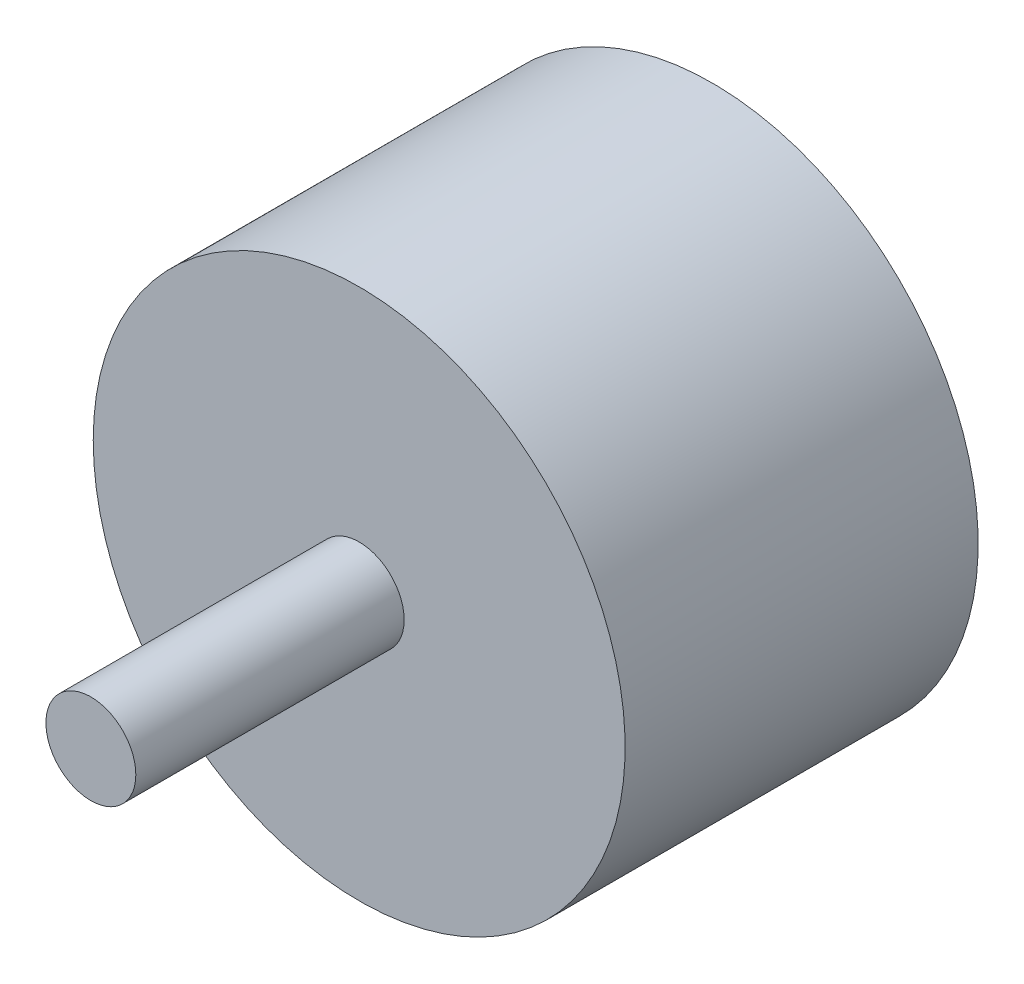
ISO-10303-21;
HEADER;
FILE_DESCRIPTION(('STEP AP214'),'2;1');
FILE_NAME('part.step','',(''),(''),'','','');
FILE_SCHEMA(('AUTOMOTIVE_DESIGN { 1 0 10303 214 1 1 1 1 }'));
ENDSEC;
DATA;
#1=APPLICATION_CONTEXT('core data for automotive mechanical design processes');
#2=APPLICATION_PROTOCOL_DEFINITION('international standard','automotive_design',2000,#1);
#3=PRODUCT_CONTEXT('',#1,'mechanical');
#4=PRODUCT('Part','Part','',(#3));
#5=PRODUCT_RELATED_PRODUCT_CATEGORY('part','',(#4));
#6=PRODUCT_DEFINITION_FORMATION('','',#4);
#7=PRODUCT_DEFINITION_CONTEXT('part definition',#1,'design');
#8=PRODUCT_DEFINITION('design','',#6,#7);
#9=PRODUCT_DEFINITION_SHAPE('','',#8);
#10=(LENGTH_UNIT() NAMED_UNIT(*) SI_UNIT(.MILLI.,.METRE.));
#11=(NAMED_UNIT(*) PLANE_ANGLE_UNIT() SI_UNIT($,.RADIAN.));
#12=(NAMED_UNIT(*) SI_UNIT($,.STERADIAN.) SOLID_ANGLE_UNIT());
#13=UNCERTAINTY_MEASURE_WITH_UNIT(LENGTH_MEASURE(1.E-05),#10,'distance_accuracy_value','');
#14=(GEOMETRIC_REPRESENTATION_CONTEXT(3) GLOBAL_UNCERTAINTY_ASSIGNED_CONTEXT((#13)) GLOBAL_UNIT_ASSIGNED_CONTEXT((#10,
#11,#12)) REPRESENTATION_CONTEXT('',''));
#15=CARTESIAN_POINT('',(0.,0.,0.));
#16=DIRECTION('',(0.,0.,1.));
#17=DIRECTION('',(1.,0.,0.));
#18=AXIS2_PLACEMENT_3D('',#15,#16,#17);
#19=CARTESIAN_POINT('',(0.,0.,19.05));
#20=DIRECTION('',(0.,0.,-1.));
#21=DIRECTION('',(-1.,0.,0.));
#22=AXIS2_PLACEMENT_3D('',#19,#20,#21);
#23=CYLINDRICAL_SURFACE('',#22,14.351);
#24=CARTESIAN_POINT('',(0.,0.,19.05));
#25=DIRECTION('',(0.,0.,1.));
#26=DIRECTION('',(1.,0.,0.));
#27=AXIS2_PLACEMENT_3D('',#24,#25,#26);
#28=CIRCLE('',#27,14.351);
#29=CARTESIAN_POINT('',(-14.351,0.,19.05));
#30=VERTEX_POINT('',#29);
#31=EDGE_CURVE('E38',#30,#30,#28,.T.);
#32=CARTESIAN_POINT('',(0.,0.,0.));
#33=DIRECTION('',(0.,0.,1.));
#34=DIRECTION('',(1.,0.,0.));
#35=AXIS2_PLACEMENT_3D('',#32,#33,#34);
#36=CIRCLE('',#35,14.351);
#37=CARTESIAN_POINT('',(-14.351,0.,0.));
#38=VERTEX_POINT('',#37);
#39=EDGE_CURVE('E34',#38,#38,#36,.T.);
#40=CARTESIAN_POINT('',(-14.351,0.,19.05));
#41=CARTESIAN_POINT('',(-14.351,0.,18.8515625));
#42=CARTESIAN_POINT('',(-14.351,0.,18.653125));
#43=CARTESIAN_POINT('',(-14.351,0.,18.25625));
#44=CARTESIAN_POINT('',(-14.351,0.,18.0578125));
#45=CARTESIAN_POINT('',(-14.351,0.,17.6609375));
#46=CARTESIAN_POINT('',(-14.351,0.,17.4625));
#47=CARTESIAN_POINT('',(-14.351,0.,17.065625));
#48=CARTESIAN_POINT('',(-14.351,0.,16.8671875));
#49=CARTESIAN_POINT('',(-14.351,0.,16.4703125));
#50=CARTESIAN_POINT('',(-14.351,0.,16.271875));
#51=CARTESIAN_POINT('',(-14.351,0.,15.875));
#52=CARTESIAN_POINT('',(-14.351,0.,15.6765625));
#53=CARTESIAN_POINT('',(-14.351,0.,15.2796875));
#54=CARTESIAN_POINT('',(-14.351,0.,15.08125));
#55=CARTESIAN_POINT('',(-14.351,0.,14.684375));
#56=CARTESIAN_POINT('',(-14.351,0.,14.4859375));
#57=CARTESIAN_POINT('',(-14.351,0.,14.0890625));
#58=CARTESIAN_POINT('',(-14.351,0.,13.890625));
#59=CARTESIAN_POINT('',(-14.351,0.,13.49375));
#60=CARTESIAN_POINT('',(-14.351,0.,13.2953125));
#61=CARTESIAN_POINT('',(-14.351,0.,12.8984375));
#62=CARTESIAN_POINT('',(-14.351,0.,12.7));
#63=CARTESIAN_POINT('',(-14.351,0.,12.303125));
#64=CARTESIAN_POINT('',(-14.351,0.,12.1046875));
#65=CARTESIAN_POINT('',(-14.351,0.,11.7078125));
#66=CARTESIAN_POINT('',(-14.351,0.,11.509375));
#67=CARTESIAN_POINT('',(-14.351,0.,11.1125));
#68=CARTESIAN_POINT('',(-14.351,0.,10.9140625));
#69=CARTESIAN_POINT('',(-14.351,0.,10.5171875));
#70=CARTESIAN_POINT('',(-14.351,0.,10.31875));
#71=CARTESIAN_POINT('',(-14.351,0.,9.921875));
#72=CARTESIAN_POINT('',(-14.351,0.,9.7234375));
#73=CARTESIAN_POINT('',(-14.351,0.,9.3265625));
#74=CARTESIAN_POINT('',(-14.351,0.,9.128125));
#75=CARTESIAN_POINT('',(-14.351,0.,8.73125));
#76=CARTESIAN_POINT('',(-14.351,0.,8.5328125));
#77=CARTESIAN_POINT('',(-14.351,0.,8.1359375));
#78=CARTESIAN_POINT('',(-14.351,0.,7.9375));
#79=CARTESIAN_POINT('',(-14.351,0.,7.540625));
#80=CARTESIAN_POINT('',(-14.351,0.,7.3421875));
#81=CARTESIAN_POINT('',(-14.351,0.,6.9453125));
#82=CARTESIAN_POINT('',(-14.351,0.,6.746875));
#83=CARTESIAN_POINT('',(-14.351,0.,6.35));
#84=CARTESIAN_POINT('',(-14.351,0.,6.1515625));
#85=CARTESIAN_POINT('',(-14.351,0.,5.7546875));
#86=CARTESIAN_POINT('',(-14.351,0.,5.55625));
#87=CARTESIAN_POINT('',(-14.351,0.,5.159375));
#88=CARTESIAN_POINT('',(-14.351,0.,4.9609375));
#89=CARTESIAN_POINT('',(-14.351,0.,4.5640625));
#90=CARTESIAN_POINT('',(-14.351,0.,4.365625));
#91=CARTESIAN_POINT('',(-14.351,0.,3.96875));
#92=CARTESIAN_POINT('',(-14.351,0.,3.7703125));
#93=CARTESIAN_POINT('',(-14.351,0.,3.3734375));
#94=CARTESIAN_POINT('',(-14.351,0.,3.175));
#95=CARTESIAN_POINT('',(-14.351,0.,2.778125));
#96=CARTESIAN_POINT('',(-14.351,0.,2.5796875));
#97=CARTESIAN_POINT('',(-14.351,0.,2.1828125));
#98=CARTESIAN_POINT('',(-14.351,0.,1.984375));
#99=CARTESIAN_POINT('',(-14.351,0.,1.5875));
#100=CARTESIAN_POINT('',(-14.351,0.,1.3890625));
#101=CARTESIAN_POINT('',(-14.351,0.,0.992187500000001));
#102=CARTESIAN_POINT('',(-14.351,0.,0.793750000000001));
#103=CARTESIAN_POINT('',(-14.351,0.,0.396875));
#104=CARTESIAN_POINT('',(-14.351,0.,0.1984375));
#105=CARTESIAN_POINT('',(-14.351,0.,0.));
#106=B_SPLINE_CURVE_WITH_KNOTS('',3,(#40,#41,#42,#43,#44,#45,#46,#47,#48,#49,#50,#51,#52,#53,
#54,#55,#56,#57,#58,#59,#60,#61,#62,#63,#64,#65,#66,#67,#68,#69,#70,#71,#72,#73,#74,#75,#76,#77,
#78,#79,#80,#81,#82,#83,#84,#85,#86,#87,#88,#89,#90,#91,#92,#93,#94,#95,#96,#97,#98,#99,#100,
#101,#102,#103,#104,#105),.UNSPECIFIED.,.F.,.F.,(4,2,2,2,2,2,2,2,2,2,2,2,2,2,2,2,2,2,2,2,2,2,2,
2,2,2,2,2,2,2,2,2,4),(0.,0.5953125,1.190625,1.7859375,2.38125,2.9765625,3.571875,4.1671875,
4.7625,5.3578125,5.953125,6.5484375,7.14375,7.7390625,8.334375,8.9296875,9.525,10.1203125,
10.715625,11.3109375,11.90625,12.5015625,13.096875,13.6921875,14.2875,14.8828125,15.478125,
16.0734375,16.66875,17.2640625,17.859375,18.4546875,19.05),.UNSPECIFIED.);
#107=EDGE_CURVE('BSEAM31',#30,#38,#106,.T.);
#108=ORIENTED_EDGE('',*,*,#31,.F.);
#109=ORIENTED_EDGE('',*,*,#39,.T.);
#110=ORIENTED_EDGE('',*,*,#107,.T.);
#111=ORIENTED_EDGE('',*,*,#107,.F.);
#112=EDGE_LOOP('',(#108,#110,#109,#111));
#113=FACE_BOUND('',#112,.T.);
#114=ADVANCED_FACE('F31',(#113),#23,.T.);
#115=CARTESIAN_POINT('',(0.,0.,19.05));
#116=DIRECTION('',(0.,0.,1.));
#117=DIRECTION('',(1.,0.,0.));
#118=AXIS2_PLACEMENT_3D('',#115,#116,#117);
#119=PLANE('',#118);
#120=CARTESIAN_POINT('',(0.,0.,19.05));
#121=DIRECTION('',(0.,0.,1.));
#122=DIRECTION('',(1.,0.,0.));
#123=AXIS2_PLACEMENT_3D('',#120,#121,#122);
#124=CIRCLE('',#123,2.4257);
#125=CARTESIAN_POINT('',(2.4257,0.,19.05));
#126=VERTEX_POINT('',#125);
#127=EDGE_CURVE('E10',#126,#126,#124,.T.);
#128=ORIENTED_EDGE('',*,*,#127,.F.);
#129=EDGE_LOOP('',(#128));
#130=FACE_BOUND('',#129,.T.);
#131=ORIENTED_EDGE('',*,*,#31,.T.);
#132=EDGE_LOOP('',(#131));
#133=FACE_BOUND('',#132,.T.);
#134=ADVANCED_FACE('F85',(#130,#133),#119,.T.);
#135=CARTESIAN_POINT('',(0.,0.,0.));
#136=DIRECTION('',(0.,0.,1.));
#137=DIRECTION('',(1.,0.,0.));
#138=AXIS2_PLACEMENT_3D('',#135,#136,#137);
#139=PLANE('',#138);
#140=CARTESIAN_POINT('',(0.,8.001,0.));
#141=DIRECTION('',(0.,0.,-1.));
#142=DIRECTION('',(-1.,0.,0.));
#143=AXIS2_PLACEMENT_3D('',#140,#141,#142);
#144=CIRCLE('',#143,1.2065);
#145=CARTESIAN_POINT('',(-1.2065,8.001,0.));
#146=VERTEX_POINT('',#145);
#147=EDGE_CURVE('E66',#146,#146,#144,.T.);
#148=ORIENTED_EDGE('',*,*,#147,.F.);
#149=EDGE_LOOP('',(#148));
#150=FACE_BOUND('',#149,.T.);
#151=CARTESIAN_POINT('',(-9.525,0.,0.));
#152=DIRECTION('',(0.,0.,-1.));
#153=DIRECTION('',(-1.,0.,0.));
#154=AXIS2_PLACEMENT_3D('',#151,#152,#153);
#155=CIRCLE('',#154,1.2065);
#156=CARTESIAN_POINT('',(-10.7315,0.,0.));
#157=VERTEX_POINT('',#156);
#158=EDGE_CURVE('E60',#157,#157,#155,.T.);
#159=ORIENTED_EDGE('',*,*,#158,.F.);
#160=EDGE_LOOP('',(#159));
#161=FACE_BOUND('',#160,.T.);
#162=CARTESIAN_POINT('',(0.,-8.001,0.));
#163=DIRECTION('',(0.,0.,-1.));
#164=DIRECTION('',(-1.,0.,0.));
#165=AXIS2_PLACEMENT_3D('',#162,#163,#164);
#166=CIRCLE('',#165,1.2065);
#167=CARTESIAN_POINT('',(-1.2065,-8.001,0.));
#168=VERTEX_POINT('',#167);
#169=EDGE_CURVE('E54',#168,#168,#166,.T.);
#170=ORIENTED_EDGE('',*,*,#169,.F.);
#171=EDGE_LOOP('',(#170));
#172=FACE_BOUND('',#171,.T.);
#173=CARTESIAN_POINT('',(9.525,0.,0.));
#174=DIRECTION('',(0.,0.,-1.));
#175=DIRECTION('',(-1.,0.,0.));
#176=AXIS2_PLACEMENT_3D('',#173,#174,#175);
#177=CIRCLE('',#176,1.2065);
#178=CARTESIAN_POINT('',(8.3185,0.,0.));
#179=VERTEX_POINT('',#178);
#180=EDGE_CURVE('E48',#179,#179,#177,.T.);
#181=ORIENTED_EDGE('',*,*,#180,.F.);
#182=EDGE_LOOP('',(#181));
#183=FACE_BOUND('',#182,.T.);
#184=ORIENTED_EDGE('',*,*,#39,.F.);
#185=EDGE_LOOP('',(#184));
#186=FACE_BOUND('',#185,.T.);
#187=ADVANCED_FACE('F81',(#150,#161,#172,#183,#186),#139,.F.);
#188=CARTESIAN_POINT('',(0.,0.,33.528));
#189=DIRECTION('',(0.,0.,-1.));
#190=DIRECTION('',(-1.,0.,0.));
#191=AXIS2_PLACEMENT_3D('',#188,#189,#190);
#192=CYLINDRICAL_SURFACE('',#191,2.4257);
#193=CARTESIAN_POINT('',(0.,0.,33.528));
#194=DIRECTION('',(0.,0.,1.));
#195=DIRECTION('',(1.,0.,0.));
#196=AXIS2_PLACEMENT_3D('',#193,#194,#195);
#197=CIRCLE('',#196,2.4257);
#198=CARTESIAN_POINT('',(2.4257,0.,33.528));
#199=VERTEX_POINT('',#198);
#200=EDGE_CURVE('E44',#199,#199,#197,.T.);
#201=ORIENTED_EDGE('',*,*,#200,.F.);
#202=EDGE_LOOP('',(#201));
#203=FACE_BOUND('',#202,.T.);
#204=ORIENTED_EDGE('',*,*,#127,.T.);
#205=EDGE_LOOP('',(#204));
#206=FACE_BOUND('',#205,.T.);
#207=ADVANCED_FACE('F84',(#203,#206),#192,.T.);
#208=CARTESIAN_POINT('',(0.,0.,33.528));
#209=DIRECTION('',(0.,0.,1.));
#210=DIRECTION('',(1.,0.,0.));
#211=AXIS2_PLACEMENT_3D('',#208,#209,#210);
#212=PLANE('',#211);
#213=ORIENTED_EDGE('',*,*,#200,.T.);
#214=EDGE_LOOP('',(#213));
#215=FACE_BOUND('',#214,.T.);
#216=ADVANCED_FACE('F109',(#215),#212,.T.);
#217=CARTESIAN_POINT('',(9.525,0.,5.08));
#218=DIRECTION('',(0.,0.,-1.));
#219=DIRECTION('',(-1.,0.,0.));
#220=AXIS2_PLACEMENT_3D('',#217,#218,#219);
#221=CYLINDRICAL_SURFACE('',#220,1.2065);
#222=CARTESIAN_POINT('',(9.525,0.,5.08));
#223=DIRECTION('',(0.,0.,-1.));
#224=DIRECTION('',(-1.,0.,0.));
#225=AXIS2_PLACEMENT_3D('',#222,#223,#224);
#226=CIRCLE('',#225,1.2065);
#227=CARTESIAN_POINT('',(8.3185,0.,5.08));
#228=VERTEX_POINT('',#227);
#229=EDGE_CURVE('E51',#228,#228,#226,.T.);
#230=ORIENTED_EDGE('',*,*,#229,.F.);
#231=EDGE_LOOP('',(#230));
#232=FACE_BOUND('',#231,.T.);
#233=ORIENTED_EDGE('',*,*,#180,.T.);
#234=EDGE_LOOP('',(#233));
#235=FACE_BOUND('',#234,.T.);
#236=ADVANCED_FACE('F113',(#232,#235),#221,.F.);
#237=CARTESIAN_POINT('',(9.525,0.,5.08));
#238=DIRECTION('',(0.,0.,-1.));
#239=DIRECTION('',(-1.,0.,0.));
#240=AXIS2_PLACEMENT_3D('',#237,#238,#239);
#241=PLANE('',#240);
#242=ORIENTED_EDGE('',*,*,#229,.T.);
#243=EDGE_LOOP('',(#242));
#244=FACE_BOUND('',#243,.T.);
#245=ADVANCED_FACE('F117',(#244),#241,.T.);
#246=CARTESIAN_POINT('',(0.,-8.001,5.08));
#247=DIRECTION('',(0.,0.,-1.));
#248=DIRECTION('',(-1.,0.,0.));
#249=AXIS2_PLACEMENT_3D('',#246,#247,#248);
#250=CYLINDRICAL_SURFACE('',#249,1.2065);
#251=CARTESIAN_POINT('',(0.,-8.001,5.08));
#252=DIRECTION('',(0.,0.,-1.));
#253=DIRECTION('',(-1.,0.,0.));
#254=AXIS2_PLACEMENT_3D('',#251,#252,#253);
#255=CIRCLE('',#254,1.2065);
#256=CARTESIAN_POINT('',(-1.2065,-8.001,5.08));
#257=VERTEX_POINT('',#256);
#258=EDGE_CURVE('E57',#257,#257,#255,.T.);
#259=ORIENTED_EDGE('',*,*,#258,.F.);
#260=EDGE_LOOP('',(#259));
#261=FACE_BOUND('',#260,.T.);
#262=ORIENTED_EDGE('',*,*,#169,.T.);
#263=EDGE_LOOP('',(#262));
#264=FACE_BOUND('',#263,.T.);
#265=ADVANCED_FACE('F121',(#261,#264),#250,.F.);
#266=CARTESIAN_POINT('',(0.,-8.001,5.08));
#267=DIRECTION('',(0.,0.,-1.));
#268=DIRECTION('',(-1.,0.,0.));
#269=AXIS2_PLACEMENT_3D('',#266,#267,#268);
#270=PLANE('',#269);
#271=ORIENTED_EDGE('',*,*,#258,.T.);
#272=EDGE_LOOP('',(#271));
#273=FACE_BOUND('',#272,.T.);
#274=ADVANCED_FACE('F125',(#273),#270,.T.);
#275=CARTESIAN_POINT('',(-9.525,0.,5.08));
#276=DIRECTION('',(0.,0.,-1.));
#277=DIRECTION('',(-1.,0.,0.));
#278=AXIS2_PLACEMENT_3D('',#275,#276,#277);
#279=CYLINDRICAL_SURFACE('',#278,1.2065);
#280=CARTESIAN_POINT('',(-9.525,0.,5.08));
#281=DIRECTION('',(0.,0.,-1.));
#282=DIRECTION('',(-1.,0.,0.));
#283=AXIS2_PLACEMENT_3D('',#280,#281,#282);
#284=CIRCLE('',#283,1.2065);
#285=CARTESIAN_POINT('',(-10.7315,0.,5.08));
#286=VERTEX_POINT('',#285);
#287=EDGE_CURVE('E63',#286,#286,#284,.T.);
#288=ORIENTED_EDGE('',*,*,#287,.F.);
#289=EDGE_LOOP('',(#288));
#290=FACE_BOUND('',#289,.T.);
#291=ORIENTED_EDGE('',*,*,#158,.T.);
#292=EDGE_LOOP('',(#291));
#293=FACE_BOUND('',#292,.T.);
#294=ADVANCED_FACE('F129',(#290,#293),#279,.F.);
#295=CARTESIAN_POINT('',(-9.525,0.,5.08));
#296=DIRECTION('',(0.,0.,-1.));
#297=DIRECTION('',(-1.,0.,0.));
#298=AXIS2_PLACEMENT_3D('',#295,#296,#297);
#299=PLANE('',#298);
#300=ORIENTED_EDGE('',*,*,#287,.T.);
#301=EDGE_LOOP('',(#300));
#302=FACE_BOUND('',#301,.T.);
#303=ADVANCED_FACE('F77',(#302),#299,.T.);
#304=CARTESIAN_POINT('',(0.,8.001,5.08));
#305=DIRECTION('',(0.,0.,-1.));
#306=DIRECTION('',(-1.,0.,0.));
#307=AXIS2_PLACEMENT_3D('',#304,#305,#306);
#308=CYLINDRICAL_SURFACE('',#307,1.2065);
#309=CARTESIAN_POINT('',(0.,8.001,5.08));
#310=DIRECTION('',(0.,0.,-1.));
#311=DIRECTION('',(-1.,0.,0.));
#312=AXIS2_PLACEMENT_3D('',#309,#310,#311);
#313=CIRCLE('',#312,1.2065);
#314=CARTESIAN_POINT('',(-1.2065,8.001,5.08));
#315=VERTEX_POINT('',#314);
#316=EDGE_CURVE('E47',#315,#315,#313,.T.);
#317=ORIENTED_EDGE('',*,*,#316,.F.);
#318=EDGE_LOOP('',(#317));
#319=FACE_BOUND('',#318,.T.);
#320=ORIENTED_EDGE('',*,*,#147,.T.);
#321=EDGE_LOOP('',(#320));
#322=FACE_BOUND('',#321,.T.);
#323=ADVANCED_FACE('F74',(#319,#322),#308,.F.);
#324=CARTESIAN_POINT('',(0.,8.001,5.08));
#325=DIRECTION('',(0.,0.,-1.));
#326=DIRECTION('',(-1.,0.,0.));
#327=AXIS2_PLACEMENT_3D('',#324,#325,#326);
#328=PLANE('',#327);
#329=ORIENTED_EDGE('',*,*,#316,.T.);
#330=EDGE_LOOP('',(#329));
#331=FACE_BOUND('',#330,.T.);
#332=ADVANCED_FACE('F72',(#331),#328,.T.);
#333=CLOSED_SHELL('',(#114,#134,#187,#207,#216,#236,#245,#265,#274,#294,#303,#323,#332));
#334=MANIFOLD_SOLID_BREP('B2',#333);
#335=ADVANCED_BREP_SHAPE_REPRESENTATION('',(#18,#334),#14);
#336=SHAPE_DEFINITION_REPRESENTATION(#9,#335);
ENDSEC;
END-ISO-10303-21;
